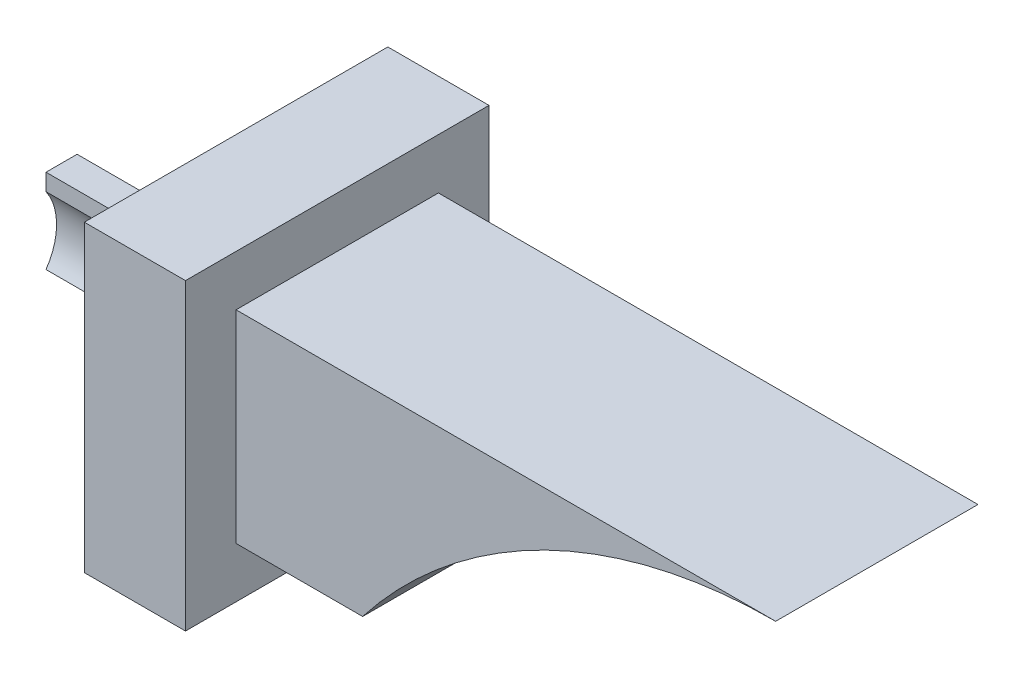
ISO-10303-21;
HEADER;
FILE_DESCRIPTION(('STEP AP214'),'2;1');
FILE_NAME('part.step','',(''),(''),'','','');
FILE_SCHEMA(('AUTOMOTIVE_DESIGN { 1 0 10303 214 1 1 1 1 }'));
ENDSEC;
DATA;
#1=APPLICATION_CONTEXT('core data for automotive mechanical design processes');
#2=APPLICATION_PROTOCOL_DEFINITION('international standard','automotive_design',2000,#1);
#3=PRODUCT_CONTEXT('',#1,'mechanical');
#4=PRODUCT('Part','Part','',(#3));
#5=PRODUCT_RELATED_PRODUCT_CATEGORY('part','',(#4));
#6=PRODUCT_DEFINITION_FORMATION('','',#4);
#7=PRODUCT_DEFINITION_CONTEXT('part definition',#1,'design');
#8=PRODUCT_DEFINITION('design','',#6,#7);
#9=PRODUCT_DEFINITION_SHAPE('','',#8);
#10=(LENGTH_UNIT() NAMED_UNIT(*) SI_UNIT(.MILLI.,.METRE.));
#11=(NAMED_UNIT(*) PLANE_ANGLE_UNIT() SI_UNIT($,.RADIAN.));
#12=(NAMED_UNIT(*) SI_UNIT($,.STERADIAN.) SOLID_ANGLE_UNIT());
#13=UNCERTAINTY_MEASURE_WITH_UNIT(LENGTH_MEASURE(1.E-05),#10,'distance_accuracy_value','');
#14=(GEOMETRIC_REPRESENTATION_CONTEXT(3) GLOBAL_UNCERTAINTY_ASSIGNED_CONTEXT((#13)) GLOBAL_UNIT_ASSIGNED_CONTEXT((#10,
#11,#12)) REPRESENTATION_CONTEXT('',''));
#15=CARTESIAN_POINT('',(0.,0.,0.));
#16=DIRECTION('',(0.,0.,1.));
#17=DIRECTION('',(1.,0.,0.));
#18=AXIS2_PLACEMENT_3D('',#15,#16,#17);
#19=CARTESIAN_POINT('',(-22.6444890634162,0.,0.));
#20=DIRECTION('',(1.,0.,0.));
#21=DIRECTION('',(0.,1.,0.));
#22=AXIS2_PLACEMENT_3D('',#19,#20,#21);
#23=PLANE('',#22);
#24=DIRECTION('',(0.,1.,0.));
#25=VECTOR('',#24,1.);
#26=CARTESIAN_POINT('',(-22.6444890634162,-9.12928143712582,15.));
#27=LINE('',#26,#25);
#28=CARTESIAN_POINT('',(-22.6444890634162,-9.12928143712582,15.));
#29=VERTEX_POINT('',#28);
#30=CARTESIAN_POINT('',(-22.6444890634163,8.87071856287418,15.));
#31=VERTEX_POINT('',#30);
#32=EDGE_CURVE('E167',#29,#31,#27,.T.);
#33=ORIENTED_EDGE('',*,*,#32,.T.);
#34=DIRECTION('',(0.,0.,-1.));
#35=VECTOR('',#34,1.);
#36=CARTESIAN_POINT('',(-22.6444890634163,8.87071856287418,-3.));
#37=LINE('',#36,#35);
#38=CARTESIAN_POINT('',(-22.6444890634163,8.87071856287418,-3.));
#39=VERTEX_POINT('',#38);
#40=EDGE_CURVE('E170',#31,#39,#37,.T.);
#41=ORIENTED_EDGE('',*,*,#40,.T.);
#42=DIRECTION('',(0.,-1.,0.));
#43=VECTOR('',#42,1.);
#44=CARTESIAN_POINT('',(-22.6444890634162,-9.12928143712582,-3.));
#45=LINE('',#44,#43);
#46=CARTESIAN_POINT('',(-22.6444890634162,-9.12928143712582,-3.));
#47=VERTEX_POINT('',#46);
#48=EDGE_CURVE('E173',#39,#47,#45,.T.);
#49=ORIENTED_EDGE('',*,*,#48,.T.);
#50=DIRECTION('',(0.,0.,1.));
#51=VECTOR('',#50,1.);
#52=CARTESIAN_POINT('',(-22.6444890634162,-9.12928143712582,-3.));
#53=LINE('',#52,#51);
#54=EDGE_CURVE('E175',#47,#29,#53,.T.);
#55=ORIENTED_EDGE('',*,*,#54,.T.);
#56=EDGE_LOOP('',(#33,#41,#49,#55));
#57=FACE_BOUND('',#56,.T.);
#58=CARTESIAN_POINT('',(-22.6444890634162,-0.426348636061207,2.55600220021899));
#59=DIRECTION('',(1.,0.,0.));
#60=DIRECTION('',(0.,-1.,0.));
#61=AXIS2_PLACEMENT_3D('',#58,#59,#60);
#62=CIRCLE('',#61,3.5);
#63=CARTESIAN_POINT('',(-22.6444890634162,1.57365136393879,5.42828352348801));
#64=VERTEX_POINT('',#63);
#65=CARTESIAN_POINT('',(-22.6444890634162,-2.42634863606121,5.42828352348801));
#66=VERTEX_POINT('',#65);
#67=EDGE_CURVE('E157',#64,#66,#62,.T.);
#68=ORIENTED_EDGE('',*,*,#67,.F.);
#69=DIRECTION('',(0.,-1.,0.));
#70=VECTOR('',#69,1.);
#71=CARTESIAN_POINT('',(-22.6444890634162,1.57365136393879,5.42828352348801));
#72=LINE('',#71,#70);
#73=CARTESIAN_POINT('',(-22.6444890634162,2.57365136393879,5.42828352348801));
#74=VERTEX_POINT('',#73);
#75=EDGE_CURVE('E154',#74,#64,#72,.T.);
#76=ORIENTED_EDGE('',*,*,#75,.F.);
#77=DIRECTION('',(0.,0.,-1.));
#78=VECTOR('',#77,1.);
#79=CARTESIAN_POINT('',(-22.6444890634162,2.57365136393879,5.42828352348801));
#80=LINE('',#79,#78);
#81=CARTESIAN_POINT('',(-22.6444890634162,2.57365136393879,7.27275706200767));
#82=VERTEX_POINT('',#81);
#83=EDGE_CURVE('E414',#82,#74,#80,.T.);
#84=ORIENTED_EDGE('',*,*,#83,.F.);
#85=DIRECTION('',(0.,1.,0.));
#86=VECTOR('',#85,1.);
#87=CARTESIAN_POINT('',(-22.6444890634162,1.57365136393879,7.27275706200768));
#88=LINE('',#87,#86);
#89=CARTESIAN_POINT('',(-22.6444890634162,1.57365136393876,7.27275706200768));
#90=VERTEX_POINT('',#89);
#91=EDGE_CURVE('E429',#90,#82,#88,.T.);
#92=ORIENTED_EDGE('',*,*,#91,.F.);
#93=CARTESIAN_POINT('',(-22.6444890634162,-0.426348636061207,10.1450383852767));
#94=DIRECTION('',(1.,0.,0.));
#95=DIRECTION('',(0.,1.,0.));
#96=AXIS2_PLACEMENT_3D('',#93,#94,#95);
#97=CIRCLE('',#96,3.5);
#98=CARTESIAN_POINT('',(-22.6444890634162,-2.42634863606121,7.27275706200768));
#99=VERTEX_POINT('',#98);
#100=EDGE_CURVE('E56',#99,#90,#97,.T.);
#101=ORIENTED_EDGE('',*,*,#100,.F.);
#102=DIRECTION('',(0.,0.,1.));
#103=VECTOR('',#102,1.);
#104=CARTESIAN_POINT('',(-22.6444890634162,-2.42634863606121,5.42828352348801));
#105=LINE('',#104,#103);
#106=EDGE_CURVE('E51',#66,#99,#105,.T.);
#107=ORIENTED_EDGE('',*,*,#106,.F.);
#108=EDGE_LOOP('',(#68,#76,#84,#92,#101,#107));
#109=FACE_BOUND('',#108,.T.);
#110=ADVANCED_FACE('F36',(#57,#109),#23,.F.);
#111=CARTESIAN_POINT('',(15.355510936584,-25.129281437126,12.));
#112=DIRECTION('',(0.,0.,-1.));
#113=DIRECTION('',(-1.,0.,0.));
#114=AXIS2_PLACEMENT_3D('',#111,#112,#113);
#115=CYLINDRICAL_SURFACE('',#114,31.0000000000003);
#116=CARTESIAN_POINT('',(15.355510936584,-25.129281437126,0.));
#117=DIRECTION('',(0.,0.,-1.));
#118=DIRECTION('',(1.,0.,0.));
#119=AXIS2_PLACEMENT_3D('',#116,#117,#118);
#120=CIRCLE('',#119,31.0000000000003);
#121=CARTESIAN_POINT('',(-9.13938649124798,-6.12928143712578,0.));
#122=VERTEX_POINT('',#121);
#123=CARTESIAN_POINT('',(15.3555109365839,5.87071856287431,0.));
#124=VERTEX_POINT('',#123);
#125=EDGE_CURVE('E193',#122,#124,#120,.T.);
#126=ORIENTED_EDGE('',*,*,#125,.T.);
#127=DIRECTION('',(0.,0.,-1.));
#128=VECTOR('',#127,1.);
#129=CARTESIAN_POINT('',(15.3555109365839,5.87071856287431,12.));
#130=LINE('',#129,#128);
#131=CARTESIAN_POINT('',(15.3555109365839,5.87071856287431,12.));
#132=VERTEX_POINT('',#131);
#133=EDGE_CURVE('E11',#132,#124,#130,.T.);
#134=ORIENTED_EDGE('',*,*,#133,.F.);
#135=CARTESIAN_POINT('',(15.355510936584,-25.129281437126,12.));
#136=DIRECTION('',(0.,0.,-1.));
#137=DIRECTION('',(1.,0.,0.));
#138=AXIS2_PLACEMENT_3D('',#135,#136,#137);
#139=CIRCLE('',#138,31.0000000000003);
#140=CARTESIAN_POINT('',(-9.13938649124798,-6.12928143712578,12.));
#141=VERTEX_POINT('',#140);
#142=EDGE_CURVE('E194',#141,#132,#139,.T.);
#143=ORIENTED_EDGE('',*,*,#142,.F.);
#144=DIRECTION('',(0.,0.,-1.));
#145=VECTOR('',#144,1.);
#146=CARTESIAN_POINT('',(-9.13938649124798,-6.12928143712578,12.));
#147=LINE('',#146,#145);
#148=EDGE_CURVE('E204',#141,#122,#147,.T.);
#149=ORIENTED_EDGE('',*,*,#148,.T.);
#150=EDGE_LOOP('',(#126,#134,#143,#149));
#151=FACE_BOUND('',#150,.T.);
#152=ADVANCED_FACE('F38',(#151),#115,.F.);
#153=CARTESIAN_POINT('',(15.3555109365839,5.87071856287431,12.));
#154=DIRECTION('',(0.,-1.,0.));
#155=DIRECTION('',(1.,0.,0.));
#156=AXIS2_PLACEMENT_3D('',#153,#154,#155);
#157=PLANE('',#156);
#158=DIRECTION('',(-1.,0.,0.));
#159=VECTOR('',#158,1.);
#160=CARTESIAN_POINT('',(15.3555109365839,5.87071856287431,0.));
#161=LINE('',#160,#159);
#162=CARTESIAN_POINT('',(-16.6444890634162,5.8707185628742,0.));
#163=VERTEX_POINT('',#162);
#164=EDGE_CURVE('E207',#124,#163,#161,.T.);
#165=ORIENTED_EDGE('',*,*,#164,.T.);
#166=DIRECTION('',(0.,0.,-1.));
#167=VECTOR('',#166,1.);
#168=CARTESIAN_POINT('',(-16.6444890634162,5.8707185628742,12.));
#169=LINE('',#168,#167);
#170=CARTESIAN_POINT('',(-16.6444890634162,5.8707185628742,12.));
#171=VERTEX_POINT('',#170);
#172=EDGE_CURVE('E44',#171,#163,#169,.T.);
#173=ORIENTED_EDGE('',*,*,#172,.F.);
#174=DIRECTION('',(-1.,0.,0.));
#175=VECTOR('',#174,1.);
#176=CARTESIAN_POINT('',(15.3555109365839,5.87071856287431,12.));
#177=LINE('',#176,#175);
#178=EDGE_CURVE('E197',#132,#171,#177,.T.);
#179=ORIENTED_EDGE('',*,*,#178,.F.);
#180=ORIENTED_EDGE('',*,*,#133,.T.);
#181=EDGE_LOOP('',(#165,#173,#179,#180));
#182=FACE_BOUND('',#181,.T.);
#183=ADVANCED_FACE('F225',(#182),#157,.F.);
#184=CARTESIAN_POINT('',(-16.6444890634162,-6.1292814371258,12.));
#185=DIRECTION('',(0.,1.,0.));
#186=DIRECTION('',(-1.,0.,0.));
#187=AXIS2_PLACEMENT_3D('',#184,#185,#186);
#188=PLANE('',#187);
#189=DIRECTION('',(1.,0.,0.));
#190=VECTOR('',#189,1.);
#191=CARTESIAN_POINT('',(-16.6444890634162,-6.1292814371258,0.));
#192=LINE('',#191,#190);
#193=CARTESIAN_POINT('',(-16.6444890634162,-6.1292814371258,0.));
#194=VERTEX_POINT('',#193);
#195=EDGE_CURVE('E198',#194,#122,#192,.T.);
#196=ORIENTED_EDGE('',*,*,#195,.T.);
#197=ORIENTED_EDGE('',*,*,#148,.F.);
#198=DIRECTION('',(1.,0.,0.));
#199=VECTOR('',#198,1.);
#200=CARTESIAN_POINT('',(-16.6444890634162,-6.1292814371258,12.));
#201=LINE('',#200,#199);
#202=CARTESIAN_POINT('',(-16.6444890634162,-6.1292814371258,12.));
#203=VERTEX_POINT('',#202);
#204=EDGE_CURVE('E202',#203,#141,#201,.T.);
#205=ORIENTED_EDGE('',*,*,#204,.F.);
#206=DIRECTION('',(0.,0.,-1.));
#207=VECTOR('',#206,1.);
#208=CARTESIAN_POINT('',(-16.6444890634162,-6.1292814371258,12.));
#209=LINE('',#208,#207);
#210=EDGE_CURVE('E216',#203,#194,#209,.T.);
#211=ORIENTED_EDGE('',*,*,#210,.T.);
#212=EDGE_LOOP('',(#196,#197,#205,#211));
#213=FACE_BOUND('',#212,.T.);
#214=ADVANCED_FACE('F233',(#213),#188,.F.);
#215=CARTESIAN_POINT('',(15.355510936584,-25.129281437126,12.));
#216=DIRECTION('',(0.,0.,1.));
#217=DIRECTION('',(1.,0.,0.));
#218=AXIS2_PLACEMENT_3D('',#215,#216,#217);
#219=PLANE('',#218);
#220=ORIENTED_EDGE('',*,*,#142,.T.);
#221=ORIENTED_EDGE('',*,*,#178,.T.);
#222=DIRECTION('',(0.,-1.,0.));
#223=VECTOR('',#222,1.);
#224=CARTESIAN_POINT('',(-16.6444890634162,5.8707185628742,12.));
#225=LINE('',#224,#223);
#226=EDGE_CURVE('E200',#171,#203,#225,.T.);
#227=ORIENTED_EDGE('',*,*,#226,.T.);
#228=ORIENTED_EDGE('',*,*,#204,.T.);
#229=EDGE_LOOP('',(#220,#221,#227,#228));
#230=FACE_BOUND('',#229,.T.);
#231=ADVANCED_FACE('F238',(#230),#219,.T.);
#232=CARTESIAN_POINT('',(15.355510936584,-25.129281437126,0.));
#233=DIRECTION('',(0.,0.,1.));
#234=DIRECTION('',(1.,0.,0.));
#235=AXIS2_PLACEMENT_3D('',#232,#233,#234);
#236=PLANE('',#235);
#237=ORIENTED_EDGE('',*,*,#125,.F.);
#238=ORIENTED_EDGE('',*,*,#195,.F.);
#239=DIRECTION('',(0.,-1.,0.));
#240=VECTOR('',#239,1.);
#241=CARTESIAN_POINT('',(-16.6444890634162,5.8707185628742,0.));
#242=LINE('',#241,#240);
#243=EDGE_CURVE('E210',#163,#194,#242,.T.);
#244=ORIENTED_EDGE('',*,*,#243,.F.);
#245=ORIENTED_EDGE('',*,*,#164,.F.);
#246=EDGE_LOOP('',(#237,#238,#244,#245));
#247=FACE_BOUND('',#246,.T.);
#248=ADVANCED_FACE('F229',(#247),#236,.F.);
#249=CARTESIAN_POINT('',(-22.6444890634162,-9.12928143712582,15.));
#250=DIRECTION('',(0.,0.,-1.));
#251=DIRECTION('',(-1.,0.,0.));
#252=AXIS2_PLACEMENT_3D('',#249,#250,#251);
#253=PLANE('',#252);
#254=DIRECTION('',(0.,1.,0.));
#255=VECTOR('',#254,1.);
#256=CARTESIAN_POINT('',(-16.6444890634162,-9.1292814371258,15.));
#257=LINE('',#256,#255);
#258=CARTESIAN_POINT('',(-16.6444890634162,-9.1292814371258,15.));
#259=VERTEX_POINT('',#258);
#260=CARTESIAN_POINT('',(-16.6444890634163,8.8707185628742,15.));
#261=VERTEX_POINT('',#260);
#262=EDGE_CURVE('E158',#259,#261,#257,.T.);
#263=ORIENTED_EDGE('',*,*,#262,.T.);
#264=DIRECTION('',(1.,0.,0.));
#265=VECTOR('',#264,1.);
#266=CARTESIAN_POINT('',(-22.6444890634163,8.87071856287418,15.));
#267=LINE('',#266,#265);
#268=EDGE_CURVE('E190',#31,#261,#267,.T.);
#269=ORIENTED_EDGE('',*,*,#268,.F.);
#270=ORIENTED_EDGE('',*,*,#32,.F.);
#271=DIRECTION('',(1.,0.,0.));
#272=VECTOR('',#271,1.);
#273=CARTESIAN_POINT('',(-22.6444890634162,-9.12928143712582,15.));
#274=LINE('',#273,#272);
#275=EDGE_CURVE('E176',#29,#259,#274,.T.);
#276=ORIENTED_EDGE('',*,*,#275,.T.);
#277=EDGE_LOOP('',(#263,#269,#270,#276));
#278=FACE_BOUND('',#277,.T.);
#279=ADVANCED_FACE('F245',(#278),#253,.F.);
#280=CARTESIAN_POINT('',(-22.6444890634163,8.87071856287418,-3.));
#281=DIRECTION('',(0.,-1.,0.));
#282=DIRECTION('',(1.,0.,0.));
#283=AXIS2_PLACEMENT_3D('',#280,#281,#282);
#284=PLANE('',#283);
#285=DIRECTION('',(0.,0.,-1.));
#286=VECTOR('',#285,1.);
#287=CARTESIAN_POINT('',(-16.6444890634163,8.8707185628742,-3.));
#288=LINE('',#287,#286);
#289=CARTESIAN_POINT('',(-16.6444890634163,8.8707185628742,-3.));
#290=VERTEX_POINT('',#289);
#291=EDGE_CURVE('E161',#261,#290,#288,.T.);
#292=ORIENTED_EDGE('',*,*,#291,.T.);
#293=DIRECTION('',(1.,0.,0.));
#294=VECTOR('',#293,1.);
#295=CARTESIAN_POINT('',(-22.6444890634163,8.87071856287418,-3.));
#296=LINE('',#295,#294);
#297=EDGE_CURVE('E187',#39,#290,#296,.T.);
#298=ORIENTED_EDGE('',*,*,#297,.F.);
#299=ORIENTED_EDGE('',*,*,#40,.F.);
#300=ORIENTED_EDGE('',*,*,#268,.T.);
#301=EDGE_LOOP('',(#292,#298,#299,#300));
#302=FACE_BOUND('',#301,.T.);
#303=ADVANCED_FACE('F267',(#302),#284,.F.);
#304=CARTESIAN_POINT('',(-22.6444890634162,-9.12928143712582,-3.));
#305=DIRECTION('',(0.,0.,1.));
#306=DIRECTION('',(1.,0.,0.));
#307=AXIS2_PLACEMENT_3D('',#304,#305,#306);
#308=PLANE('',#307);
#309=DIRECTION('',(0.,-1.,0.));
#310=VECTOR('',#309,1.);
#311=CARTESIAN_POINT('',(-16.6444890634162,-9.1292814371258,-3.));
#312=LINE('',#311,#310);
#313=CARTESIAN_POINT('',(-16.6444890634162,-9.1292814371258,-3.));
#314=VERTEX_POINT('',#313);
#315=EDGE_CURVE('E179',#290,#314,#312,.T.);
#316=ORIENTED_EDGE('',*,*,#315,.T.);
#317=DIRECTION('',(1.,0.,0.));
#318=VECTOR('',#317,1.);
#319=CARTESIAN_POINT('',(-22.6444890634162,-9.12928143712582,-3.));
#320=LINE('',#319,#318);
#321=EDGE_CURVE('E184',#47,#314,#320,.T.);
#322=ORIENTED_EDGE('',*,*,#321,.F.);
#323=ORIENTED_EDGE('',*,*,#48,.F.);
#324=ORIENTED_EDGE('',*,*,#297,.T.);
#325=EDGE_LOOP('',(#316,#322,#323,#324));
#326=FACE_BOUND('',#325,.T.);
#327=ADVANCED_FACE('F263',(#326),#308,.F.);
#328=CARTESIAN_POINT('',(-22.6444890634162,-9.12928143712582,-3.));
#329=DIRECTION('',(0.,1.,0.));
#330=DIRECTION('',(-1.,0.,0.));
#331=AXIS2_PLACEMENT_3D('',#328,#329,#330);
#332=PLANE('',#331);
#333=DIRECTION('',(0.,0.,1.));
#334=VECTOR('',#333,1.);
#335=CARTESIAN_POINT('',(-16.6444890634162,-9.1292814371258,-3.));
#336=LINE('',#335,#334);
#337=EDGE_CURVE('E171',#314,#259,#336,.T.);
#338=ORIENTED_EDGE('',*,*,#337,.T.);
#339=ORIENTED_EDGE('',*,*,#275,.F.);
#340=ORIENTED_EDGE('',*,*,#54,.F.);
#341=ORIENTED_EDGE('',*,*,#321,.T.);
#342=EDGE_LOOP('',(#338,#339,#340,#341));
#343=FACE_BOUND('',#342,.T.);
#344=ADVANCED_FACE('F260',(#343),#332,.F.);
#345=CARTESIAN_POINT('',(-16.6444890634162,0.,0.));
#346=DIRECTION('',(1.,0.,0.));
#347=DIRECTION('',(0.,1.,0.));
#348=AXIS2_PLACEMENT_3D('',#345,#346,#347);
#349=PLANE('',#348);
#350=ORIENTED_EDGE('',*,*,#172,.T.);
#351=ORIENTED_EDGE('',*,*,#243,.T.);
#352=ORIENTED_EDGE('',*,*,#210,.F.);
#353=ORIENTED_EDGE('',*,*,#226,.F.);
#354=EDGE_LOOP('',(#350,#351,#352,#353));
#355=FACE_BOUND('',#354,.T.);
#356=ORIENTED_EDGE('',*,*,#262,.F.);
#357=ORIENTED_EDGE('',*,*,#337,.F.);
#358=ORIENTED_EDGE('',*,*,#315,.F.);
#359=ORIENTED_EDGE('',*,*,#291,.F.);
#360=EDGE_LOOP('',(#356,#357,#358,#359));
#361=FACE_BOUND('',#360,.T.);
#362=ADVANCED_FACE('F221',(#355,#361),#349,.T.);
#363=CARTESIAN_POINT('',(-32.6444890634162,-0.426348636061242,2.55600220021899));
#364=DIRECTION('',(1.,0.,0.));
#365=DIRECTION('',(0.,1.,0.));
#366=AXIS2_PLACEMENT_3D('',#363,#364,#365);
#367=CYLINDRICAL_SURFACE('',#366,3.5);
#368=ORIENTED_EDGE('',*,*,#67,.T.);
#369=DIRECTION('',(1.,0.,0.));
#370=VECTOR('',#369,1.);
#371=CARTESIAN_POINT('',(-32.6444890634162,-2.42634863606124,5.42828352348801));
#372=LINE('',#371,#370);
#373=CARTESIAN_POINT('',(-32.6444890634162,-2.42634863606124,5.42828352348801));
#374=VERTEX_POINT('',#373);
#375=EDGE_CURVE('E138',#374,#66,#372,.T.);
#376=ORIENTED_EDGE('',*,*,#375,.F.);
#377=CARTESIAN_POINT('',(-32.6444890634162,-0.426348636061242,2.55600220021899));
#378=DIRECTION('',(1.,0.,0.));
#379=DIRECTION('',(0.,-1.,0.));
#380=AXIS2_PLACEMENT_3D('',#377,#378,#379);
#381=CIRCLE('',#380,3.5);
#382=CARTESIAN_POINT('',(-32.6444890634162,1.57365136393876,5.42828352348801));
#383=VERTEX_POINT('',#382);
#384=EDGE_CURVE('E145',#383,#374,#381,.T.);
#385=ORIENTED_EDGE('',*,*,#384,.F.);
#386=DIRECTION('',(1.,0.,0.));
#387=VECTOR('',#386,1.);
#388=CARTESIAN_POINT('',(-32.6444890634162,1.57365136393876,5.42828352348801));
#389=LINE('',#388,#387);
#390=EDGE_CURVE('E410',#383,#64,#389,.T.);
#391=ORIENTED_EDGE('',*,*,#390,.T.);
#392=EDGE_LOOP('',(#368,#376,#385,#391));
#393=FACE_BOUND('',#392,.T.);
#394=ADVANCED_FACE('F156',(#393),#367,.F.);
#395=CARTESIAN_POINT('',(-32.6444890634162,-2.42634863606124,5.42828352348801));
#396=DIRECTION('',(0.,1.,0.));
#397=DIRECTION('',(-1.,0.,0.));
#398=AXIS2_PLACEMENT_3D('',#395,#396,#397);
#399=PLANE('',#398);
#400=ORIENTED_EDGE('',*,*,#106,.T.);
#401=DIRECTION('',(1.,0.,0.));
#402=VECTOR('',#401,1.);
#403=CARTESIAN_POINT('',(-32.6444890634162,-2.42634863606124,7.27275706200768));
#404=LINE('',#403,#402);
#405=CARTESIAN_POINT('',(-32.6444890634162,-2.42634863606124,7.27275706200768));
#406=VERTEX_POINT('',#405);
#407=EDGE_CURVE('E141',#406,#99,#404,.T.);
#408=ORIENTED_EDGE('',*,*,#407,.F.);
#409=DIRECTION('',(0.,0.,1.));
#410=VECTOR('',#409,1.);
#411=CARTESIAN_POINT('',(-32.6444890634162,-2.42634863606124,5.42828352348801));
#412=LINE('',#411,#410);
#413=EDGE_CURVE('E134',#374,#406,#412,.T.);
#414=ORIENTED_EDGE('',*,*,#413,.F.);
#415=ORIENTED_EDGE('',*,*,#375,.T.);
#416=EDGE_LOOP('',(#400,#408,#414,#415));
#417=FACE_BOUND('',#416,.T.);
#418=ADVANCED_FACE('F136',(#417),#399,.F.);
#419=CARTESIAN_POINT('',(-32.6444890634162,-0.426348636061242,10.1450383852767));
#420=DIRECTION('',(1.,0.,0.));
#421=DIRECTION('',(0.,1.,0.));
#422=AXIS2_PLACEMENT_3D('',#419,#420,#421);
#423=CYLINDRICAL_SURFACE('',#422,3.5);
#424=ORIENTED_EDGE('',*,*,#100,.T.);
#425=DIRECTION('',(1.,0.,0.));
#426=VECTOR('',#425,1.);
#427=CARTESIAN_POINT('',(-32.6444890634162,1.57365136393876,7.27275706200768));
#428=LINE('',#427,#426);
#429=CARTESIAN_POINT('',(-32.6444890634162,1.57365136393876,7.27275706200768));
#430=VERTEX_POINT('',#429);
#431=EDGE_CURVE('E163',#430,#90,#428,.T.);
#432=ORIENTED_EDGE('',*,*,#431,.F.);
#433=CARTESIAN_POINT('',(-32.6444890634162,-0.426348636061242,10.1450383852767));
#434=DIRECTION('',(1.,0.,0.));
#435=DIRECTION('',(0.,1.,0.));
#436=AXIS2_PLACEMENT_3D('',#433,#434,#435);
#437=CIRCLE('',#436,3.5);
#438=EDGE_CURVE('E144',#406,#430,#437,.T.);
#439=ORIENTED_EDGE('',*,*,#438,.F.);
#440=ORIENTED_EDGE('',*,*,#407,.T.);
#441=EDGE_LOOP('',(#424,#432,#439,#440));
#442=FACE_BOUND('',#441,.T.);
#443=ADVANCED_FACE('F314',(#442),#423,.F.);
#444=CARTESIAN_POINT('',(-32.6444890634162,1.57365136393876,7.27275706200768));
#445=DIRECTION('',(0.,0.,-1.));
#446=DIRECTION('',(0.,1.,0.));
#447=AXIS2_PLACEMENT_3D('',#444,#445,#446);
#448=PLANE('',#447);
#449=ORIENTED_EDGE('',*,*,#91,.T.);
#450=DIRECTION('',(1.,0.,0.));
#451=VECTOR('',#450,1.);
#452=CARTESIAN_POINT('',(-32.6444890634162,2.57365136393876,7.27275706200767));
#453=LINE('',#452,#451);
#454=CARTESIAN_POINT('',(-32.6444890634162,2.57365136393876,7.27275706200767));
#455=VERTEX_POINT('',#454);
#456=EDGE_CURVE('E417',#455,#82,#453,.T.);
#457=ORIENTED_EDGE('',*,*,#456,.F.);
#458=DIRECTION('',(0.,1.,0.));
#459=VECTOR('',#458,1.);
#460=CARTESIAN_POINT('',(-32.6444890634162,1.57365136393876,7.27275706200768));
#461=LINE('',#460,#459);
#462=EDGE_CURVE('E430',#430,#455,#461,.T.);
#463=ORIENTED_EDGE('',*,*,#462,.F.);
#464=ORIENTED_EDGE('',*,*,#431,.T.);
#465=EDGE_LOOP('',(#449,#457,#463,#464));
#466=FACE_BOUND('',#465,.T.);
#467=ADVANCED_FACE('F320',(#466),#448,.F.);
#468=CARTESIAN_POINT('',(-32.6444890634162,2.57365136393876,5.42828352348801));
#469=DIRECTION('',(0.,-1.,0.));
#470=DIRECTION('',(1.,0.,0.));
#471=AXIS2_PLACEMENT_3D('',#468,#469,#470);
#472=PLANE('',#471);
#473=ORIENTED_EDGE('',*,*,#83,.T.);
#474=DIRECTION('',(1.,0.,0.));
#475=VECTOR('',#474,1.);
#476=CARTESIAN_POINT('',(-32.6444890634162,2.57365136393876,5.42828352348801));
#477=LINE('',#476,#475);
#478=CARTESIAN_POINT('',(-32.6444890634162,2.57365136393876,5.42828352348801));
#479=VERTEX_POINT('',#478);
#480=EDGE_CURVE('E412',#479,#74,#477,.T.);
#481=ORIENTED_EDGE('',*,*,#480,.F.);
#482=DIRECTION('',(0.,0.,-1.));
#483=VECTOR('',#482,1.);
#484=CARTESIAN_POINT('',(-32.6444890634162,2.57365136393876,5.42828352348801));
#485=LINE('',#484,#483);
#486=EDGE_CURVE('E419',#455,#479,#485,.T.);
#487=ORIENTED_EDGE('',*,*,#486,.F.);
#488=ORIENTED_EDGE('',*,*,#456,.T.);
#489=EDGE_LOOP('',(#473,#481,#487,#488));
#490=FACE_BOUND('',#489,.T.);
#491=ADVANCED_FACE('F328',(#490),#472,.F.);
#492=CARTESIAN_POINT('',(-32.6444890634162,1.57365136393876,5.42828352348801));
#493=DIRECTION('',(0.,0.,1.));
#494=DIRECTION('',(1.,0.,0.));
#495=AXIS2_PLACEMENT_3D('',#492,#493,#494);
#496=PLANE('',#495);
#497=ORIENTED_EDGE('',*,*,#75,.T.);
#498=ORIENTED_EDGE('',*,*,#390,.F.);
#499=DIRECTION('',(0.,-1.,0.));
#500=VECTOR('',#499,1.);
#501=CARTESIAN_POINT('',(-32.6444890634162,1.57365136393876,5.42828352348801));
#502=LINE('',#501,#500);
#503=EDGE_CURVE('E150',#479,#383,#502,.T.);
#504=ORIENTED_EDGE('',*,*,#503,.F.);
#505=ORIENTED_EDGE('',*,*,#480,.T.);
#506=EDGE_LOOP('',(#497,#498,#504,#505));
#507=FACE_BOUND('',#506,.T.);
#508=ADVANCED_FACE('F336',(#507),#496,.F.);
#509=CARTESIAN_POINT('',(-32.6444890634162,-0.426348636061242,2.55600220021899));
#510=DIRECTION('',(-1.,0.,0.));
#511=DIRECTION('',(0.,-1.,0.));
#512=AXIS2_PLACEMENT_3D('',#509,#510,#511);
#513=PLANE('',#512);
#514=ORIENTED_EDGE('',*,*,#384,.T.);
#515=ORIENTED_EDGE('',*,*,#413,.T.);
#516=ORIENTED_EDGE('',*,*,#438,.T.);
#517=ORIENTED_EDGE('',*,*,#462,.T.);
#518=ORIENTED_EDGE('',*,*,#486,.T.);
#519=ORIENTED_EDGE('',*,*,#503,.T.);
#520=EDGE_LOOP('',(#514,#515,#516,#517,#518,#519));
#521=FACE_BOUND('',#520,.T.);
#522=ADVANCED_FACE('F148',(#521),#513,.T.);
#523=CLOSED_SHELL('',(#110,#152,#183,#214,#231,#248,#279,#303,#327,#344,#362,#394,#418,#443,
#467,#491,#508,#522));
#524=MANIFOLD_SOLID_BREP('B2',#523);
#525=ADVANCED_BREP_SHAPE_REPRESENTATION('',(#18,#524),#14);
#526=SHAPE_DEFINITION_REPRESENTATION(#9,#525);
ENDSEC;
END-ISO-10303-21;
